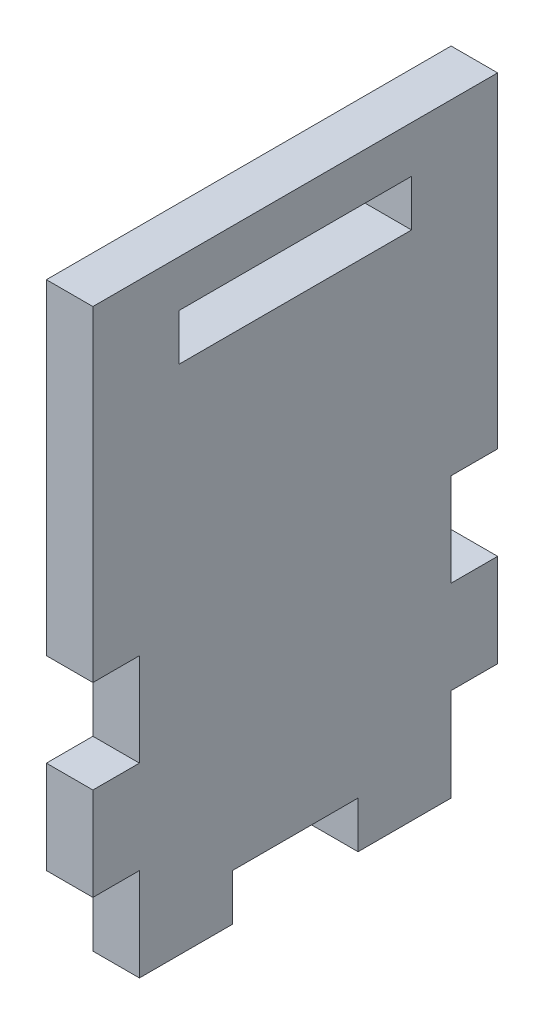
ISO-10303-21;
HEADER;
FILE_DESCRIPTION(('STEP AP214'),'2;1');
FILE_NAME('part.step','',(''),(''),'','','');
FILE_SCHEMA(('AUTOMOTIVE_DESIGN { 1 0 10303 214 1 1 1 1 }'));
ENDSEC;
DATA;
#1=APPLICATION_CONTEXT('core data for automotive mechanical design processes');
#2=APPLICATION_PROTOCOL_DEFINITION('international standard','automotive_design',2000,#1);
#3=PRODUCT_CONTEXT('',#1,'mechanical');
#4=PRODUCT('Part','Part','',(#3));
#5=PRODUCT_RELATED_PRODUCT_CATEGORY('part','',(#4));
#6=PRODUCT_DEFINITION_FORMATION('','',#4);
#7=PRODUCT_DEFINITION_CONTEXT('part definition',#1,'design');
#8=PRODUCT_DEFINITION('design','',#6,#7);
#9=PRODUCT_DEFINITION_SHAPE('','',#8);
#10=(LENGTH_UNIT() NAMED_UNIT(*) SI_UNIT(.MILLI.,.METRE.));
#11=(NAMED_UNIT(*) PLANE_ANGLE_UNIT() SI_UNIT($,.RADIAN.));
#12=(NAMED_UNIT(*) SI_UNIT($,.STERADIAN.) SOLID_ANGLE_UNIT());
#13=UNCERTAINTY_MEASURE_WITH_UNIT(LENGTH_MEASURE(1.E-05),#10,'distance_accuracy_value','');
#14=(GEOMETRIC_REPRESENTATION_CONTEXT(3) GLOBAL_UNCERTAINTY_ASSIGNED_CONTEXT((#13)) GLOBAL_UNIT_ASSIGNED_CONTEXT((#10,
#11,#12)) REPRESENTATION_CONTEXT('',''));
#15=CARTESIAN_POINT('',(0.,0.,0.));
#16=DIRECTION('',(0.,0.,1.));
#17=DIRECTION('',(1.,0.,0.));
#18=AXIS2_PLACEMENT_3D('',#15,#16,#17);
#19=CARTESIAN_POINT('',(3.,0.,0.));
#20=DIRECTION('',(-1.,0.,0.));
#21=DIRECTION('',(0.,0.,1.));
#22=AXIS2_PLACEMENT_3D('',#19,#20,#21);
#23=PLANE('',#22);
#24=DIRECTION('',(0.,0.,1.));
#25=VECTOR('',#24,1.);
#26=CARTESIAN_POINT('',(3.,19.5,13.05));
#27=LINE('',#26,#25);
#28=CARTESIAN_POINT('',(3.,19.5,-13.05));
#29=VERTEX_POINT('',#28);
#30=CARTESIAN_POINT('',(3.,19.5,13.05));
#31=VERTEX_POINT('',#30);
#32=EDGE_CURVE('E230',#29,#31,#27,.T.);
#33=ORIENTED_EDGE('',*,*,#32,.T.);
#34=DIRECTION('',(0.,-1.,0.));
#35=VECTOR('',#34,1.);
#36=CARTESIAN_POINT('',(3.,10.5,13.05));
#37=LINE('',#36,#35);
#38=CARTESIAN_POINT('',(3.,-1.5,13.05));
#39=VERTEX_POINT('',#38);
#40=EDGE_CURVE('E233',#31,#39,#37,.T.);
#41=ORIENTED_EDGE('',*,*,#40,.T.);
#42=DIRECTION('',(0.,0.,-1.));
#43=VECTOR('',#42,1.);
#44=CARTESIAN_POINT('',(3.,-1.5,10.05));
#45=LINE('',#44,#43);
#46=CARTESIAN_POINT('',(3.,-1.5,10.05));
#47=VERTEX_POINT('',#46);
#48=EDGE_CURVE('E236',#39,#47,#45,.T.);
#49=ORIENTED_EDGE('',*,*,#48,.T.);
#50=DIRECTION('',(0.,-1.,0.));
#51=VECTOR('',#50,1.);
#52=CARTESIAN_POINT('',(3.,-7.5,10.05));
#53=LINE('',#52,#51);
#54=CARTESIAN_POINT('',(3.,-7.5,10.05));
#55=VERTEX_POINT('',#54);
#56=EDGE_CURVE('E238',#47,#55,#53,.T.);
#57=ORIENTED_EDGE('',*,*,#56,.T.);
#58=DIRECTION('',(0.,0.,1.));
#59=VECTOR('',#58,1.);
#60=CARTESIAN_POINT('',(3.,-7.5,13.05));
#61=LINE('',#60,#59);
#62=CARTESIAN_POINT('',(3.,-7.5,13.05));
#63=VERTEX_POINT('',#62);
#64=EDGE_CURVE('E240',#55,#63,#61,.T.);
#65=ORIENTED_EDGE('',*,*,#64,.T.);
#66=DIRECTION('',(0.,-1.,0.));
#67=VECTOR('',#66,1.);
#68=CARTESIAN_POINT('',(3.,-13.5,13.05));
#69=LINE('',#68,#67);
#70=CARTESIAN_POINT('',(3.,-13.5,13.05));
#71=VERTEX_POINT('',#70);
#72=EDGE_CURVE('E242',#63,#71,#69,.T.);
#73=ORIENTED_EDGE('',*,*,#72,.T.);
#74=DIRECTION('',(0.,0.,-1.));
#75=VECTOR('',#74,1.);
#76=CARTESIAN_POINT('',(3.,-13.5,10.05));
#77=LINE('',#76,#75);
#78=CARTESIAN_POINT('',(3.,-13.5,10.05));
#79=VERTEX_POINT('',#78);
#80=EDGE_CURVE('E244',#71,#79,#77,.T.);
#81=ORIENTED_EDGE('',*,*,#80,.T.);
#82=DIRECTION('',(0.,-1.,0.));
#83=VECTOR('',#82,1.);
#84=CARTESIAN_POINT('',(3.,-19.5,10.05));
#85=LINE('',#84,#83);
#86=CARTESIAN_POINT('',(3.,-19.5,10.05));
#87=VERTEX_POINT('',#86);
#88=EDGE_CURVE('E246',#79,#87,#85,.T.);
#89=ORIENTED_EDGE('',*,*,#88,.T.);
#90=DIRECTION('',(0.,0.,-1.));
#91=VECTOR('',#90,1.);
#92=CARTESIAN_POINT('',(3.,-19.5,4.05));
#93=LINE('',#92,#91);
#94=CARTESIAN_POINT('',(3.,-19.5,4.05));
#95=VERTEX_POINT('',#94);
#96=EDGE_CURVE('E248',#87,#95,#93,.T.);
#97=ORIENTED_EDGE('',*,*,#96,.T.);
#98=DIRECTION('',(0.,1.,0.));
#99=VECTOR('',#98,1.);
#100=CARTESIAN_POINT('',(3.,-16.5,4.05));
#101=LINE('',#100,#99);
#102=CARTESIAN_POINT('',(3.,-16.5,4.05));
#103=VERTEX_POINT('',#102);
#104=EDGE_CURVE('E250',#95,#103,#101,.T.);
#105=ORIENTED_EDGE('',*,*,#104,.T.);
#106=DIRECTION('',(0.,0.,-1.));
#107=VECTOR('',#106,1.);
#108=CARTESIAN_POINT('',(3.,-16.5,-4.05000000000003));
#109=LINE('',#108,#107);
#110=CARTESIAN_POINT('',(3.,-16.5,-4.05000000000003));
#111=VERTEX_POINT('',#110);
#112=EDGE_CURVE('E252',#103,#111,#109,.T.);
#113=ORIENTED_EDGE('',*,*,#112,.T.);
#114=DIRECTION('',(0.,-1.,0.));
#115=VECTOR('',#114,1.);
#116=CARTESIAN_POINT('',(3.,-19.5,-4.05000000000003));
#117=LINE('',#116,#115);
#118=CARTESIAN_POINT('',(3.,-19.5,-4.05000000000003));
#119=VERTEX_POINT('',#118);
#120=EDGE_CURVE('E254',#111,#119,#117,.T.);
#121=ORIENTED_EDGE('',*,*,#120,.T.);
#122=DIRECTION('',(0.,0.,-1.));
#123=VECTOR('',#122,1.);
#124=CARTESIAN_POINT('',(3.,-19.5,-10.05));
#125=LINE('',#124,#123);
#126=CARTESIAN_POINT('',(3.,-19.5,-10.05));
#127=VERTEX_POINT('',#126);
#128=EDGE_CURVE('E256',#119,#127,#125,.T.);
#129=ORIENTED_EDGE('',*,*,#128,.T.);
#130=DIRECTION('',(0.,1.,0.));
#131=VECTOR('',#130,1.);
#132=CARTESIAN_POINT('',(3.,-13.5,-10.05));
#133=LINE('',#132,#131);
#134=CARTESIAN_POINT('',(3.,-13.5,-10.05));
#135=VERTEX_POINT('',#134);
#136=EDGE_CURVE('E258',#127,#135,#133,.T.);
#137=ORIENTED_EDGE('',*,*,#136,.T.);
#138=DIRECTION('',(0.,0.,-1.));
#139=VECTOR('',#138,1.);
#140=CARTESIAN_POINT('',(3.,-13.5,-13.05));
#141=LINE('',#140,#139);
#142=CARTESIAN_POINT('',(3.,-13.5,-13.05));
#143=VERTEX_POINT('',#142);
#144=EDGE_CURVE('E260',#135,#143,#141,.T.);
#145=ORIENTED_EDGE('',*,*,#144,.T.);
#146=DIRECTION('',(0.,1.,0.));
#147=VECTOR('',#146,1.);
#148=CARTESIAN_POINT('',(3.,-13.5,-13.05));
#149=LINE('',#148,#147);
#150=CARTESIAN_POINT('',(3.,-7.5,-13.05));
#151=VERTEX_POINT('',#150);
#152=EDGE_CURVE('E262',#143,#151,#149,.T.);
#153=ORIENTED_EDGE('',*,*,#152,.T.);
#154=DIRECTION('',(0.,0.,1.));
#155=VECTOR('',#154,1.);
#156=CARTESIAN_POINT('',(3.,-7.5,-10.05));
#157=LINE('',#156,#155);
#158=CARTESIAN_POINT('',(3.,-7.5,-10.05));
#159=VERTEX_POINT('',#158);
#160=EDGE_CURVE('E264',#151,#159,#157,.T.);
#161=ORIENTED_EDGE('',*,*,#160,.T.);
#162=DIRECTION('',(0.,1.,0.));
#163=VECTOR('',#162,1.);
#164=CARTESIAN_POINT('',(3.,-1.5,-10.05));
#165=LINE('',#164,#163);
#166=CARTESIAN_POINT('',(3.,-1.5,-10.05));
#167=VERTEX_POINT('',#166);
#168=EDGE_CURVE('E266',#159,#167,#165,.T.);
#169=ORIENTED_EDGE('',*,*,#168,.T.);
#170=DIRECTION('',(0.,0.,-1.));
#171=VECTOR('',#170,1.);
#172=CARTESIAN_POINT('',(3.,-1.5,-13.05));
#173=LINE('',#172,#171);
#174=CARTESIAN_POINT('',(3.,-1.5,-13.05));
#175=VERTEX_POINT('',#174);
#176=EDGE_CURVE('E268',#167,#175,#173,.T.);
#177=ORIENTED_EDGE('',*,*,#176,.T.);
#178=DIRECTION('',(0.,1.,0.));
#179=VECTOR('',#178,1.);
#180=CARTESIAN_POINT('',(3.,10.5,-13.05));
#181=LINE('',#180,#179);
#182=EDGE_CURVE('E270',#175,#29,#181,.T.);
#183=ORIENTED_EDGE('',*,*,#182,.T.);
#184=EDGE_LOOP('',(#33,#41,#49,#57,#65,#73,#81,#89,#97,#105,#113,#121,#129,#137,#145,#153,#161,
#169,#177,#183));
#185=FACE_BOUND('',#184,.T.);
#186=DIRECTION('',(0.,-1.,0.));
#187=VECTOR('',#186,1.);
#188=CARTESIAN_POINT('',(3.,16.5,7.5));
#189=LINE('',#188,#187);
#190=CARTESIAN_POINT('',(3.,16.5,7.5));
#191=VERTEX_POINT('',#190);
#192=CARTESIAN_POINT('',(3.,13.5,7.5));
#193=VERTEX_POINT('',#192);
#194=EDGE_CURVE('E194',#191,#193,#189,.T.);
#195=ORIENTED_EDGE('',*,*,#194,.F.);
#196=DIRECTION('',(0.,0.,1.));
#197=VECTOR('',#196,1.);
#198=CARTESIAN_POINT('',(3.,16.5,7.5));
#199=LINE('',#198,#197);
#200=CARTESIAN_POINT('',(3.,16.5,-7.5));
#201=VERTEX_POINT('',#200);
#202=EDGE_CURVE('E216',#201,#191,#199,.T.);
#203=ORIENTED_EDGE('',*,*,#202,.F.);
#204=DIRECTION('',(0.,1.,0.));
#205=VECTOR('',#204,1.);
#206=CARTESIAN_POINT('',(3.,16.5,-7.5));
#207=LINE('',#206,#205);
#208=CARTESIAN_POINT('',(3.,13.5,-7.5));
#209=VERTEX_POINT('',#208);
#210=EDGE_CURVE('E214',#209,#201,#207,.T.);
#211=ORIENTED_EDGE('',*,*,#210,.F.);
#212=DIRECTION('',(0.,0.,-1.));
#213=VECTOR('',#212,1.);
#214=CARTESIAN_POINT('',(3.,13.5,7.5));
#215=LINE('',#214,#213);
#216=EDGE_CURVE('E202',#193,#209,#215,.T.);
#217=ORIENTED_EDGE('',*,*,#216,.F.);
#218=EDGE_LOOP('',(#195,#203,#211,#217));
#219=FACE_BOUND('',#218,.T.);
#220=ADVANCED_FACE('F33',(#185,#219),#23,.F.);
#221=CARTESIAN_POINT('',(0.,0.,0.));
#222=DIRECTION('',(-1.,0.,0.));
#223=DIRECTION('',(0.,0.,1.));
#224=AXIS2_PLACEMENT_3D('',#221,#222,#223);
#225=PLANE('',#224);
#226=DIRECTION('',(0.,0.,1.));
#227=VECTOR('',#226,1.);
#228=CARTESIAN_POINT('',(0.,19.5,13.05));
#229=LINE('',#228,#227);
#230=CARTESIAN_POINT('',(0.,19.5,-13.05));
#231=VERTEX_POINT('',#230);
#232=CARTESIAN_POINT('',(0.,19.5,13.05));
#233=VERTEX_POINT('',#232);
#234=EDGE_CURVE('E210',#231,#233,#229,.T.);
#235=ORIENTED_EDGE('',*,*,#234,.F.);
#236=DIRECTION('',(0.,1.,0.));
#237=VECTOR('',#236,1.);
#238=CARTESIAN_POINT('',(0.,19.5,-13.05));
#239=LINE('',#238,#237);
#240=CARTESIAN_POINT('',(0.,-1.5,-13.05));
#241=VERTEX_POINT('',#240);
#242=EDGE_CURVE('E234',#241,#231,#239,.T.);
#243=ORIENTED_EDGE('',*,*,#242,.F.);
#244=DIRECTION('',(0.,0.,-1.));
#245=VECTOR('',#244,1.);
#246=CARTESIAN_POINT('',(0.,-1.5,-13.05));
#247=LINE('',#246,#245);
#248=CARTESIAN_POINT('',(0.,-1.5,-10.05));
#249=VERTEX_POINT('',#248);
#250=EDGE_CURVE('E309',#249,#241,#247,.T.);
#251=ORIENTED_EDGE('',*,*,#250,.F.);
#252=DIRECTION('',(0.,1.,0.));
#253=VECTOR('',#252,1.);
#254=CARTESIAN_POINT('',(0.,-1.5,-10.05));
#255=LINE('',#254,#253);
#256=CARTESIAN_POINT('',(0.,-7.5,-10.05));
#257=VERTEX_POINT('',#256);
#258=EDGE_CURVE('E307',#257,#249,#255,.T.);
#259=ORIENTED_EDGE('',*,*,#258,.F.);
#260=DIRECTION('',(0.,0.,1.));
#261=VECTOR('',#260,1.);
#262=CARTESIAN_POINT('',(0.,-7.5,-10.05));
#263=LINE('',#262,#261);
#264=CARTESIAN_POINT('',(0.,-7.5,-13.05));
#265=VERTEX_POINT('',#264);
#266=EDGE_CURVE('E305',#265,#257,#263,.T.);
#267=ORIENTED_EDGE('',*,*,#266,.F.);
#268=DIRECTION('',(0.,1.,0.));
#269=VECTOR('',#268,1.);
#270=CARTESIAN_POINT('',(0.,-13.5,-13.05));
#271=LINE('',#270,#269);
#272=CARTESIAN_POINT('',(0.,-13.5,-13.05));
#273=VERTEX_POINT('',#272);
#274=EDGE_CURVE('E303',#273,#265,#271,.T.);
#275=ORIENTED_EDGE('',*,*,#274,.F.);
#276=DIRECTION('',(0.,0.,-1.));
#277=VECTOR('',#276,1.);
#278=CARTESIAN_POINT('',(0.,-13.5,-13.05));
#279=LINE('',#278,#277);
#280=CARTESIAN_POINT('',(0.,-13.5,-10.05));
#281=VERTEX_POINT('',#280);
#282=EDGE_CURVE('E301',#281,#273,#279,.T.);
#283=ORIENTED_EDGE('',*,*,#282,.F.);
#284=DIRECTION('',(0.,1.,0.));
#285=VECTOR('',#284,1.);
#286=CARTESIAN_POINT('',(0.,-13.5,-10.05));
#287=LINE('',#286,#285);
#288=CARTESIAN_POINT('',(0.,-19.5,-10.05));
#289=VERTEX_POINT('',#288);
#290=EDGE_CURVE('E299',#289,#281,#287,.T.);
#291=ORIENTED_EDGE('',*,*,#290,.F.);
#292=DIRECTION('',(0.,0.,-1.));
#293=VECTOR('',#292,1.);
#294=CARTESIAN_POINT('',(0.,-19.5,-10.05));
#295=LINE('',#294,#293);
#296=CARTESIAN_POINT('',(0.,-19.5,-4.05000000000003));
#297=VERTEX_POINT('',#296);
#298=EDGE_CURVE('E297',#297,#289,#295,.T.);
#299=ORIENTED_EDGE('',*,*,#298,.F.);
#300=DIRECTION('',(0.,-1.,0.));
#301=VECTOR('',#300,1.);
#302=CARTESIAN_POINT('',(0.,-19.5,-4.05000000000003));
#303=LINE('',#302,#301);
#304=CARTESIAN_POINT('',(0.,-16.5,-4.05000000000003));
#305=VERTEX_POINT('',#304);
#306=EDGE_CURVE('E295',#305,#297,#303,.T.);
#307=ORIENTED_EDGE('',*,*,#306,.F.);
#308=DIRECTION('',(0.,0.,-1.));
#309=VECTOR('',#308,1.);
#310=CARTESIAN_POINT('',(0.,-16.5,-4.05000000000003));
#311=LINE('',#310,#309);
#312=CARTESIAN_POINT('',(0.,-16.5,4.05));
#313=VERTEX_POINT('',#312);
#314=EDGE_CURVE('E293',#313,#305,#311,.T.);
#315=ORIENTED_EDGE('',*,*,#314,.F.);
#316=DIRECTION('',(0.,1.,0.));
#317=VECTOR('',#316,1.);
#318=CARTESIAN_POINT('',(0.,-16.5,4.05));
#319=LINE('',#318,#317);
#320=CARTESIAN_POINT('',(0.,-19.5,4.05));
#321=VERTEX_POINT('',#320);
#322=EDGE_CURVE('E291',#321,#313,#319,.T.);
#323=ORIENTED_EDGE('',*,*,#322,.F.);
#324=DIRECTION('',(0.,0.,-1.));
#325=VECTOR('',#324,1.);
#326=CARTESIAN_POINT('',(0.,-19.5,4.05));
#327=LINE('',#326,#325);
#328=CARTESIAN_POINT('',(0.,-19.5,10.05));
#329=VERTEX_POINT('',#328);
#330=EDGE_CURVE('E289',#329,#321,#327,.T.);
#331=ORIENTED_EDGE('',*,*,#330,.F.);
#332=DIRECTION('',(0.,-1.,0.));
#333=VECTOR('',#332,1.);
#334=CARTESIAN_POINT('',(0.,-19.5,10.05));
#335=LINE('',#334,#333);
#336=CARTESIAN_POINT('',(0.,-13.5,10.05));
#337=VERTEX_POINT('',#336);
#338=EDGE_CURVE('E287',#337,#329,#335,.T.);
#339=ORIENTED_EDGE('',*,*,#338,.F.);
#340=DIRECTION('',(0.,0.,-1.));
#341=VECTOR('',#340,1.);
#342=CARTESIAN_POINT('',(0.,-13.5,10.05));
#343=LINE('',#342,#341);
#344=CARTESIAN_POINT('',(0.,-13.5,13.05));
#345=VERTEX_POINT('',#344);
#346=EDGE_CURVE('E285',#345,#337,#343,.T.);
#347=ORIENTED_EDGE('',*,*,#346,.F.);
#348=DIRECTION('',(0.,-1.,0.));
#349=VECTOR('',#348,1.);
#350=CARTESIAN_POINT('',(0.,-13.5,13.05));
#351=LINE('',#350,#349);
#352=CARTESIAN_POINT('',(0.,-7.5,13.05));
#353=VERTEX_POINT('',#352);
#354=EDGE_CURVE('E283',#353,#345,#351,.T.);
#355=ORIENTED_EDGE('',*,*,#354,.F.);
#356=DIRECTION('',(0.,0.,1.));
#357=VECTOR('',#356,1.);
#358=CARTESIAN_POINT('',(0.,-7.5,13.05));
#359=LINE('',#358,#357);
#360=CARTESIAN_POINT('',(0.,-7.5,10.05));
#361=VERTEX_POINT('',#360);
#362=EDGE_CURVE('E281',#361,#353,#359,.T.);
#363=ORIENTED_EDGE('',*,*,#362,.F.);
#364=DIRECTION('',(0.,-1.,0.));
#365=VECTOR('',#364,1.);
#366=CARTESIAN_POINT('',(0.,-7.5,10.05));
#367=LINE('',#366,#365);
#368=CARTESIAN_POINT('',(0.,-1.5,10.05));
#369=VERTEX_POINT('',#368);
#370=EDGE_CURVE('E279',#369,#361,#367,.T.);
#371=ORIENTED_EDGE('',*,*,#370,.F.);
#372=DIRECTION('',(0.,0.,-1.));
#373=VECTOR('',#372,1.);
#374=CARTESIAN_POINT('',(0.,-1.5,10.05));
#375=LINE('',#374,#373);
#376=CARTESIAN_POINT('',(0.,-1.5,13.05));
#377=VERTEX_POINT('',#376);
#378=EDGE_CURVE('E277',#377,#369,#375,.T.);
#379=ORIENTED_EDGE('',*,*,#378,.F.);
#380=DIRECTION('',(0.,-1.,0.));
#381=VECTOR('',#380,1.);
#382=CARTESIAN_POINT('',(0.,-1.5,13.05));
#383=LINE('',#382,#381);
#384=EDGE_CURVE('E275',#233,#377,#383,.T.);
#385=ORIENTED_EDGE('',*,*,#384,.F.);
#386=EDGE_LOOP('',(#235,#243,#251,#259,#267,#275,#283,#291,#299,#307,#315,#323,#331,#339,#347,
#355,#363,#371,#379,#385));
#387=FACE_BOUND('',#386,.T.);
#388=DIRECTION('',(0.,0.,1.));
#389=VECTOR('',#388,1.);
#390=CARTESIAN_POINT('',(0.,16.5,7.5));
#391=LINE('',#390,#389);
#392=CARTESIAN_POINT('',(0.,16.5,-7.5));
#393=VERTEX_POINT('',#392);
#394=CARTESIAN_POINT('',(0.,16.5,7.5));
#395=VERTEX_POINT('',#394);
#396=EDGE_CURVE('E203',#393,#395,#391,.T.);
#397=ORIENTED_EDGE('',*,*,#396,.T.);
#398=DIRECTION('',(0.,-1.,0.));
#399=VECTOR('',#398,1.);
#400=CARTESIAN_POINT('',(0.,16.5,7.5));
#401=LINE('',#400,#399);
#402=CARTESIAN_POINT('',(0.,13.5,7.5));
#403=VERTEX_POINT('',#402);
#404=EDGE_CURVE('E56',#395,#403,#401,.T.);
#405=ORIENTED_EDGE('',*,*,#404,.T.);
#406=DIRECTION('',(0.,0.,-1.));
#407=VECTOR('',#406,1.);
#408=CARTESIAN_POINT('',(0.,13.5,7.5));
#409=LINE('',#408,#407);
#410=CARTESIAN_POINT('',(0.,13.5,-7.5));
#411=VERTEX_POINT('',#410);
#412=EDGE_CURVE('E209',#403,#411,#409,.T.);
#413=ORIENTED_EDGE('',*,*,#412,.T.);
#414=DIRECTION('',(0.,1.,0.));
#415=VECTOR('',#414,1.);
#416=CARTESIAN_POINT('',(0.,16.5,-7.5));
#417=LINE('',#416,#415);
#418=EDGE_CURVE('E222',#411,#393,#417,.T.);
#419=ORIENTED_EDGE('',*,*,#418,.T.);
#420=EDGE_LOOP('',(#397,#405,#413,#419));
#421=FACE_BOUND('',#420,.T.);
#422=ADVANCED_FACE('F376',(#387,#421),#225,.T.);
#423=CARTESIAN_POINT('',(3.,19.5,13.05));
#424=DIRECTION('',(0.,-1.,0.));
#425=DIRECTION('',(0.,0.,-1.));
#426=AXIS2_PLACEMENT_3D('',#423,#424,#425);
#427=PLANE('',#426);
#428=ORIENTED_EDGE('',*,*,#234,.T.);
#429=DIRECTION('',(-1.,0.,0.));
#430=VECTOR('',#429,1.);
#431=CARTESIAN_POINT('',(3.,19.5,13.05));
#432=LINE('',#431,#430);
#433=EDGE_CURVE('E11',#31,#233,#432,.T.);
#434=ORIENTED_EDGE('',*,*,#433,.F.);
#435=ORIENTED_EDGE('',*,*,#32,.F.);
#436=DIRECTION('',(-1.,0.,0.));
#437=VECTOR('',#436,1.);
#438=CARTESIAN_POINT('',(3.,19.5,-13.05));
#439=LINE('',#438,#437);
#440=EDGE_CURVE('E272',#29,#231,#439,.T.);
#441=ORIENTED_EDGE('',*,*,#440,.T.);
#442=EDGE_LOOP('',(#428,#434,#435,#441));
#443=FACE_BOUND('',#442,.T.);
#444=ADVANCED_FACE('F35',(#443),#427,.F.);
#445=CARTESIAN_POINT('',(3.,-1.5,13.05));
#446=DIRECTION('',(0.,0.,-1.));
#447=DIRECTION('',(-1.,0.,0.));
#448=AXIS2_PLACEMENT_3D('',#445,#446,#447);
#449=PLANE('',#448);
#450=ORIENTED_EDGE('',*,*,#384,.T.);
#451=DIRECTION('',(-1.,0.,0.));
#452=VECTOR('',#451,1.);
#453=CARTESIAN_POINT('',(3.,-1.5,13.05));
#454=LINE('',#453,#452);
#455=EDGE_CURVE('E41',#39,#377,#454,.T.);
#456=ORIENTED_EDGE('',*,*,#455,.F.);
#457=ORIENTED_EDGE('',*,*,#40,.F.);
#458=ORIENTED_EDGE('',*,*,#433,.T.);
#459=EDGE_LOOP('',(#450,#456,#457,#458));
#460=FACE_BOUND('',#459,.T.);
#461=ADVANCED_FACE('F393',(#460),#449,.F.);
#462=CARTESIAN_POINT('',(3.,-1.5,10.05));
#463=DIRECTION('',(0.,1.,0.));
#464=DIRECTION('',(0.,0.,1.));
#465=AXIS2_PLACEMENT_3D('',#462,#463,#464);
#466=PLANE('',#465);
#467=ORIENTED_EDGE('',*,*,#378,.T.);
#468=DIRECTION('',(-1.,0.,0.));
#469=VECTOR('',#468,1.);
#470=CARTESIAN_POINT('',(3.,-1.5,10.05));
#471=LINE('',#470,#469);
#472=EDGE_CURVE('E363',#47,#369,#471,.T.);
#473=ORIENTED_EDGE('',*,*,#472,.F.);
#474=ORIENTED_EDGE('',*,*,#48,.F.);
#475=ORIENTED_EDGE('',*,*,#455,.T.);
#476=EDGE_LOOP('',(#467,#473,#474,#475));
#477=FACE_BOUND('',#476,.T.);
#478=ADVANCED_FACE('F370',(#477),#466,.F.);
#479=CARTESIAN_POINT('',(3.,-7.5,10.05));
#480=DIRECTION('',(0.,0.,-1.));
#481=DIRECTION('',(-1.,0.,0.));
#482=AXIS2_PLACEMENT_3D('',#479,#480,#481);
#483=PLANE('',#482);
#484=ORIENTED_EDGE('',*,*,#370,.T.);
#485=DIRECTION('',(-1.,0.,0.));
#486=VECTOR('',#485,1.);
#487=CARTESIAN_POINT('',(3.,-7.5,10.05));
#488=LINE('',#487,#486);
#489=EDGE_CURVE('E360',#55,#361,#488,.T.);
#490=ORIENTED_EDGE('',*,*,#489,.F.);
#491=ORIENTED_EDGE('',*,*,#56,.F.);
#492=ORIENTED_EDGE('',*,*,#472,.T.);
#493=EDGE_LOOP('',(#484,#490,#491,#492));
#494=FACE_BOUND('',#493,.T.);
#495=ADVANCED_FACE('F382',(#494),#483,.F.);
#496=CARTESIAN_POINT('',(3.,-7.5,13.05));
#497=DIRECTION('',(0.,-1.,0.));
#498=DIRECTION('',(0.,0.,-1.));
#499=AXIS2_PLACEMENT_3D('',#496,#497,#498);
#500=PLANE('',#499);
#501=ORIENTED_EDGE('',*,*,#362,.T.);
#502=DIRECTION('',(-1.,0.,0.));
#503=VECTOR('',#502,1.);
#504=CARTESIAN_POINT('',(3.,-7.5,13.05));
#505=LINE('',#504,#503);
#506=EDGE_CURVE('E357',#63,#353,#505,.T.);
#507=ORIENTED_EDGE('',*,*,#506,.F.);
#508=ORIENTED_EDGE('',*,*,#64,.F.);
#509=ORIENTED_EDGE('',*,*,#489,.T.);
#510=EDGE_LOOP('',(#501,#507,#508,#509));
#511=FACE_BOUND('',#510,.T.);
#512=ADVANCED_FACE('F386',(#511),#500,.F.);
#513=CARTESIAN_POINT('',(3.,-13.5,13.05));
#514=DIRECTION('',(0.,0.,-1.));
#515=DIRECTION('',(-1.,0.,0.));
#516=AXIS2_PLACEMENT_3D('',#513,#514,#515);
#517=PLANE('',#516);
#518=ORIENTED_EDGE('',*,*,#354,.T.);
#519=DIRECTION('',(-1.,0.,0.));
#520=VECTOR('',#519,1.);
#521=CARTESIAN_POINT('',(3.,-13.5,13.05));
#522=LINE('',#521,#520);
#523=EDGE_CURVE('E354',#71,#345,#522,.T.);
#524=ORIENTED_EDGE('',*,*,#523,.F.);
#525=ORIENTED_EDGE('',*,*,#72,.F.);
#526=ORIENTED_EDGE('',*,*,#506,.T.);
#527=EDGE_LOOP('',(#518,#524,#525,#526));
#528=FACE_BOUND('',#527,.T.);
#529=ADVANCED_FACE('F465',(#528),#517,.F.);
#530=CARTESIAN_POINT('',(3.,-13.5,10.05));
#531=DIRECTION('',(0.,1.,0.));
#532=DIRECTION('',(0.,0.,1.));
#533=AXIS2_PLACEMENT_3D('',#530,#531,#532);
#534=PLANE('',#533);
#535=ORIENTED_EDGE('',*,*,#346,.T.);
#536=DIRECTION('',(-1.,0.,0.));
#537=VECTOR('',#536,1.);
#538=CARTESIAN_POINT('',(3.,-13.5,10.05));
#539=LINE('',#538,#537);
#540=EDGE_CURVE('E351',#79,#337,#539,.T.);
#541=ORIENTED_EDGE('',*,*,#540,.F.);
#542=ORIENTED_EDGE('',*,*,#80,.F.);
#543=ORIENTED_EDGE('',*,*,#523,.T.);
#544=EDGE_LOOP('',(#535,#541,#542,#543));
#545=FACE_BOUND('',#544,.T.);
#546=ADVANCED_FACE('F463',(#545),#534,.F.);
#547=CARTESIAN_POINT('',(3.,-19.5,10.05));
#548=DIRECTION('',(0.,0.,-1.));
#549=DIRECTION('',(-1.,0.,0.));
#550=AXIS2_PLACEMENT_3D('',#547,#548,#549);
#551=PLANE('',#550);
#552=ORIENTED_EDGE('',*,*,#338,.T.);
#553=DIRECTION('',(-1.,0.,0.));
#554=VECTOR('',#553,1.);
#555=CARTESIAN_POINT('',(3.,-19.5,10.05));
#556=LINE('',#555,#554);
#557=EDGE_CURVE('E348',#87,#329,#556,.T.);
#558=ORIENTED_EDGE('',*,*,#557,.F.);
#559=ORIENTED_EDGE('',*,*,#88,.F.);
#560=ORIENTED_EDGE('',*,*,#540,.T.);
#561=EDGE_LOOP('',(#552,#558,#559,#560));
#562=FACE_BOUND('',#561,.T.);
#563=ADVANCED_FACE('F458',(#562),#551,.F.);
#564=CARTESIAN_POINT('',(3.,-19.5,4.05));
#565=DIRECTION('',(0.,1.,0.));
#566=DIRECTION('',(0.,0.,1.));
#567=AXIS2_PLACEMENT_3D('',#564,#565,#566);
#568=PLANE('',#567);
#569=ORIENTED_EDGE('',*,*,#330,.T.);
#570=DIRECTION('',(-1.,0.,0.));
#571=VECTOR('',#570,1.);
#572=CARTESIAN_POINT('',(3.,-19.5,4.05));
#573=LINE('',#572,#571);
#574=EDGE_CURVE('E345',#95,#321,#573,.T.);
#575=ORIENTED_EDGE('',*,*,#574,.F.);
#576=ORIENTED_EDGE('',*,*,#96,.F.);
#577=ORIENTED_EDGE('',*,*,#557,.T.);
#578=EDGE_LOOP('',(#569,#575,#576,#577));
#579=FACE_BOUND('',#578,.T.);
#580=ADVANCED_FACE('F453',(#579),#568,.F.);
#581=CARTESIAN_POINT('',(3.,-16.5,4.05));
#582=DIRECTION('',(0.,0.,1.));
#583=DIRECTION('',(1.,0.,0.));
#584=AXIS2_PLACEMENT_3D('',#581,#582,#583);
#585=PLANE('',#584);
#586=ORIENTED_EDGE('',*,*,#322,.T.);
#587=DIRECTION('',(-1.,0.,0.));
#588=VECTOR('',#587,1.);
#589=CARTESIAN_POINT('',(3.,-16.5,4.05));
#590=LINE('',#589,#588);
#591=EDGE_CURVE('E342',#103,#313,#590,.T.);
#592=ORIENTED_EDGE('',*,*,#591,.F.);
#593=ORIENTED_EDGE('',*,*,#104,.F.);
#594=ORIENTED_EDGE('',*,*,#574,.T.);
#595=EDGE_LOOP('',(#586,#592,#593,#594));
#596=FACE_BOUND('',#595,.T.);
#597=ADVANCED_FACE('F449',(#596),#585,.F.);
#598=CARTESIAN_POINT('',(3.,-16.5,-4.05000000000003));
#599=DIRECTION('',(0.,1.,0.));
#600=DIRECTION('',(0.,0.,1.));
#601=AXIS2_PLACEMENT_3D('',#598,#599,#600);
#602=PLANE('',#601);
#603=ORIENTED_EDGE('',*,*,#314,.T.);
#604=DIRECTION('',(-1.,0.,0.));
#605=VECTOR('',#604,1.);
#606=CARTESIAN_POINT('',(3.,-16.5,-4.05000000000003));
#607=LINE('',#606,#605);
#608=EDGE_CURVE('E339',#111,#305,#607,.T.);
#609=ORIENTED_EDGE('',*,*,#608,.F.);
#610=ORIENTED_EDGE('',*,*,#112,.F.);
#611=ORIENTED_EDGE('',*,*,#591,.T.);
#612=EDGE_LOOP('',(#603,#609,#610,#611));
#613=FACE_BOUND('',#612,.T.);
#614=ADVANCED_FACE('F444',(#613),#602,.F.);
#615=CARTESIAN_POINT('',(3.,-19.5,-4.05000000000003));
#616=DIRECTION('',(0.,0.,-1.));
#617=DIRECTION('',(-1.,0.,0.));
#618=AXIS2_PLACEMENT_3D('',#615,#616,#617);
#619=PLANE('',#618);
#620=ORIENTED_EDGE('',*,*,#306,.T.);
#621=DIRECTION('',(-1.,0.,0.));
#622=VECTOR('',#621,1.);
#623=CARTESIAN_POINT('',(3.,-19.5,-4.05000000000003));
#624=LINE('',#623,#622);
#625=EDGE_CURVE('E336',#119,#297,#624,.T.);
#626=ORIENTED_EDGE('',*,*,#625,.F.);
#627=ORIENTED_EDGE('',*,*,#120,.F.);
#628=ORIENTED_EDGE('',*,*,#608,.T.);
#629=EDGE_LOOP('',(#620,#626,#627,#628));
#630=FACE_BOUND('',#629,.T.);
#631=ADVANCED_FACE('F438',(#630),#619,.F.);
#632=CARTESIAN_POINT('',(3.,-19.5,-10.05));
#633=DIRECTION('',(0.,1.,0.));
#634=DIRECTION('',(0.,0.,1.));
#635=AXIS2_PLACEMENT_3D('',#632,#633,#634);
#636=PLANE('',#635);
#637=ORIENTED_EDGE('',*,*,#298,.T.);
#638=DIRECTION('',(-1.,0.,0.));
#639=VECTOR('',#638,1.);
#640=CARTESIAN_POINT('',(3.,-19.5,-10.05));
#641=LINE('',#640,#639);
#642=EDGE_CURVE('E333',#127,#289,#641,.T.);
#643=ORIENTED_EDGE('',*,*,#642,.F.);
#644=ORIENTED_EDGE('',*,*,#128,.F.);
#645=ORIENTED_EDGE('',*,*,#625,.T.);
#646=EDGE_LOOP('',(#637,#643,#644,#645));
#647=FACE_BOUND('',#646,.T.);
#648=ADVANCED_FACE('F434',(#647),#636,.F.);
#649=CARTESIAN_POINT('',(3.,-13.5,-10.05));
#650=DIRECTION('',(0.,0.,1.));
#651=DIRECTION('',(1.,0.,0.));
#652=AXIS2_PLACEMENT_3D('',#649,#650,#651);
#653=PLANE('',#652);
#654=ORIENTED_EDGE('',*,*,#290,.T.);
#655=DIRECTION('',(-1.,0.,0.));
#656=VECTOR('',#655,1.);
#657=CARTESIAN_POINT('',(3.,-13.5,-10.05));
#658=LINE('',#657,#656);
#659=EDGE_CURVE('E330',#135,#281,#658,.T.);
#660=ORIENTED_EDGE('',*,*,#659,.F.);
#661=ORIENTED_EDGE('',*,*,#136,.F.);
#662=ORIENTED_EDGE('',*,*,#642,.T.);
#663=EDGE_LOOP('',(#654,#660,#661,#662));
#664=FACE_BOUND('',#663,.T.);
#665=ADVANCED_FACE('F429',(#664),#653,.F.);
#666=CARTESIAN_POINT('',(3.,-13.5,-13.05));
#667=DIRECTION('',(0.,1.,0.));
#668=DIRECTION('',(0.,0.,1.));
#669=AXIS2_PLACEMENT_3D('',#666,#667,#668);
#670=PLANE('',#669);
#671=ORIENTED_EDGE('',*,*,#282,.T.);
#672=DIRECTION('',(-1.,0.,0.));
#673=VECTOR('',#672,1.);
#674=CARTESIAN_POINT('',(3.,-13.5,-13.05));
#675=LINE('',#674,#673);
#676=EDGE_CURVE('E327',#143,#273,#675,.T.);
#677=ORIENTED_EDGE('',*,*,#676,.F.);
#678=ORIENTED_EDGE('',*,*,#144,.F.);
#679=ORIENTED_EDGE('',*,*,#659,.T.);
#680=EDGE_LOOP('',(#671,#677,#678,#679));
#681=FACE_BOUND('',#680,.T.);
#682=ADVANCED_FACE('F423',(#681),#670,.F.);
#683=CARTESIAN_POINT('',(3.,-13.5,-13.05));
#684=DIRECTION('',(0.,0.,1.));
#685=DIRECTION('',(1.,0.,0.));
#686=AXIS2_PLACEMENT_3D('',#683,#684,#685);
#687=PLANE('',#686);
#688=ORIENTED_EDGE('',*,*,#274,.T.);
#689=DIRECTION('',(-1.,0.,0.));
#690=VECTOR('',#689,1.);
#691=CARTESIAN_POINT('',(3.,-7.5,-13.05));
#692=LINE('',#691,#690);
#693=EDGE_CURVE('E324',#151,#265,#692,.T.);
#694=ORIENTED_EDGE('',*,*,#693,.F.);
#695=ORIENTED_EDGE('',*,*,#152,.F.);
#696=ORIENTED_EDGE('',*,*,#676,.T.);
#697=EDGE_LOOP('',(#688,#694,#695,#696));
#698=FACE_BOUND('',#697,.T.);
#699=ADVANCED_FACE('F419',(#698),#687,.F.);
#700=CARTESIAN_POINT('',(3.,-7.5,-10.05));
#701=DIRECTION('',(0.,-1.,0.));
#702=DIRECTION('',(0.,0.,-1.));
#703=AXIS2_PLACEMENT_3D('',#700,#701,#702);
#704=PLANE('',#703);
#705=ORIENTED_EDGE('',*,*,#266,.T.);
#706=DIRECTION('',(-1.,0.,0.));
#707=VECTOR('',#706,1.);
#708=CARTESIAN_POINT('',(3.,-7.5,-10.05));
#709=LINE('',#708,#707);
#710=EDGE_CURVE('E321',#159,#257,#709,.T.);
#711=ORIENTED_EDGE('',*,*,#710,.F.);
#712=ORIENTED_EDGE('',*,*,#160,.F.);
#713=ORIENTED_EDGE('',*,*,#693,.T.);
#714=EDGE_LOOP('',(#705,#711,#712,#713));
#715=FACE_BOUND('',#714,.T.);
#716=ADVANCED_FACE('F415',(#715),#704,.F.);
#717=CARTESIAN_POINT('',(3.,-1.5,-10.05));
#718=DIRECTION('',(0.,0.,1.));
#719=DIRECTION('',(0.,-1.,0.));
#720=AXIS2_PLACEMENT_3D('',#717,#718,#719);
#721=PLANE('',#720);
#722=ORIENTED_EDGE('',*,*,#258,.T.);
#723=DIRECTION('',(-1.,0.,0.));
#724=VECTOR('',#723,1.);
#725=CARTESIAN_POINT('',(3.,-1.5,-10.05));
#726=LINE('',#725,#724);
#727=EDGE_CURVE('E318',#167,#249,#726,.T.);
#728=ORIENTED_EDGE('',*,*,#727,.F.);
#729=ORIENTED_EDGE('',*,*,#168,.F.);
#730=ORIENTED_EDGE('',*,*,#710,.T.);
#731=EDGE_LOOP('',(#722,#728,#729,#730));
#732=FACE_BOUND('',#731,.T.);
#733=ADVANCED_FACE('F410',(#732),#721,.F.);
#734=CARTESIAN_POINT('',(3.,-1.5,-13.05));
#735=DIRECTION('',(0.,1.,0.));
#736=DIRECTION('',(0.,0.,1.));
#737=AXIS2_PLACEMENT_3D('',#734,#735,#736);
#738=PLANE('',#737);
#739=ORIENTED_EDGE('',*,*,#250,.T.);
#740=DIRECTION('',(-1.,0.,0.));
#741=VECTOR('',#740,1.);
#742=CARTESIAN_POINT('',(3.,-1.5,-13.05));
#743=LINE('',#742,#741);
#744=EDGE_CURVE('E315',#175,#241,#743,.T.);
#745=ORIENTED_EDGE('',*,*,#744,.F.);
#746=ORIENTED_EDGE('',*,*,#176,.F.);
#747=ORIENTED_EDGE('',*,*,#727,.T.);
#748=EDGE_LOOP('',(#739,#745,#746,#747));
#749=FACE_BOUND('',#748,.T.);
#750=ADVANCED_FACE('F401',(#749),#738,.F.);
#751=CARTESIAN_POINT('',(3.,19.5,-13.05));
#752=DIRECTION('',(0.,0.,1.));
#753=DIRECTION('',(0.,-1.,0.));
#754=AXIS2_PLACEMENT_3D('',#751,#752,#753);
#755=PLANE('',#754);
#756=ORIENTED_EDGE('',*,*,#242,.T.);
#757=ORIENTED_EDGE('',*,*,#440,.F.);
#758=ORIENTED_EDGE('',*,*,#182,.F.);
#759=ORIENTED_EDGE('',*,*,#744,.T.);
#760=EDGE_LOOP('',(#756,#757,#758,#759));
#761=FACE_BOUND('',#760,.T.);
#762=ADVANCED_FACE('F405',(#761),#755,.F.);
#763=CARTESIAN_POINT('',(3.,16.5,7.5));
#764=DIRECTION('',(0.,0.,-1.));
#765=DIRECTION('',(0.,1.,0.));
#766=AXIS2_PLACEMENT_3D('',#763,#764,#765);
#767=PLANE('',#766);
#768=ORIENTED_EDGE('',*,*,#404,.F.);
#769=DIRECTION('',(-1.,0.,0.));
#770=VECTOR('',#769,1.);
#771=CARTESIAN_POINT('',(3.,16.5,7.5));
#772=LINE('',#771,#770);
#773=EDGE_CURVE('E198',#191,#395,#772,.T.);
#774=ORIENTED_EDGE('',*,*,#773,.F.);
#775=ORIENTED_EDGE('',*,*,#194,.T.);
#776=DIRECTION('',(-1.,0.,0.));
#777=VECTOR('',#776,1.);
#778=CARTESIAN_POINT('',(3.,13.5,7.5));
#779=LINE('',#778,#777);
#780=EDGE_CURVE('E197',#193,#403,#779,.T.);
#781=ORIENTED_EDGE('',*,*,#780,.T.);
#782=EDGE_LOOP('',(#768,#774,#775,#781));
#783=FACE_BOUND('',#782,.T.);
#784=ADVANCED_FACE('F196',(#783),#767,.T.);
#785=CARTESIAN_POINT('',(3.,13.5,7.5));
#786=DIRECTION('',(0.,1.,0.));
#787=DIRECTION('',(0.,0.,1.));
#788=AXIS2_PLACEMENT_3D('',#785,#786,#787);
#789=PLANE('',#788);
#790=ORIENTED_EDGE('',*,*,#412,.F.);
#791=ORIENTED_EDGE('',*,*,#780,.F.);
#792=ORIENTED_EDGE('',*,*,#216,.T.);
#793=DIRECTION('',(-1.,0.,0.));
#794=VECTOR('',#793,1.);
#795=CARTESIAN_POINT('',(3.,13.5,-7.5));
#796=LINE('',#795,#794);
#797=EDGE_CURVE('E211',#209,#411,#796,.T.);
#798=ORIENTED_EDGE('',*,*,#797,.T.);
#799=EDGE_LOOP('',(#790,#791,#792,#798));
#800=FACE_BOUND('',#799,.T.);
#801=ADVANCED_FACE('F206',(#800),#789,.T.);
#802=CARTESIAN_POINT('',(3.,16.5,-7.5));
#803=DIRECTION('',(0.,0.,1.));
#804=DIRECTION('',(0.,-1.,0.));
#805=AXIS2_PLACEMENT_3D('',#802,#803,#804);
#806=PLANE('',#805);
#807=ORIENTED_EDGE('',*,*,#418,.F.);
#808=ORIENTED_EDGE('',*,*,#797,.F.);
#809=ORIENTED_EDGE('',*,*,#210,.T.);
#810=DIRECTION('',(-1.,0.,0.));
#811=VECTOR('',#810,1.);
#812=CARTESIAN_POINT('',(3.,16.5,-7.5));
#813=LINE('',#812,#811);
#814=EDGE_CURVE('E48',#201,#393,#813,.T.);
#815=ORIENTED_EDGE('',*,*,#814,.T.);
#816=EDGE_LOOP('',(#807,#808,#809,#815));
#817=FACE_BOUND('',#816,.T.);
#818=ADVANCED_FACE('F571',(#817),#806,.T.);
#819=CARTESIAN_POINT('',(3.,16.5,7.5));
#820=DIRECTION('',(0.,-1.,0.));
#821=DIRECTION('',(0.,0.,-1.));
#822=AXIS2_PLACEMENT_3D('',#819,#820,#821);
#823=PLANE('',#822);
#824=ORIENTED_EDGE('',*,*,#396,.F.);
#825=ORIENTED_EDGE('',*,*,#814,.F.);
#826=ORIENTED_EDGE('',*,*,#202,.T.);
#827=ORIENTED_EDGE('',*,*,#773,.T.);
#828=EDGE_LOOP('',(#824,#825,#826,#827));
#829=FACE_BOUND('',#828,.T.);
#830=ADVANCED_FACE('F577',(#829),#823,.T.);
#831=CLOSED_SHELL('',(#220,#422,#444,#461,#478,#495,#512,#529,#546,#563,#580,#597,#614,#631,
#648,#665,#682,#699,#716,#733,#750,#762,#784,#801,#818,#830));
#832=MANIFOLD_SOLID_BREP('B2',#831);
#833=ADVANCED_BREP_SHAPE_REPRESENTATION('',(#18,#832),#14);
#834=SHAPE_DEFINITION_REPRESENTATION(#9,#833);
ENDSEC;
END-ISO-10303-21;
